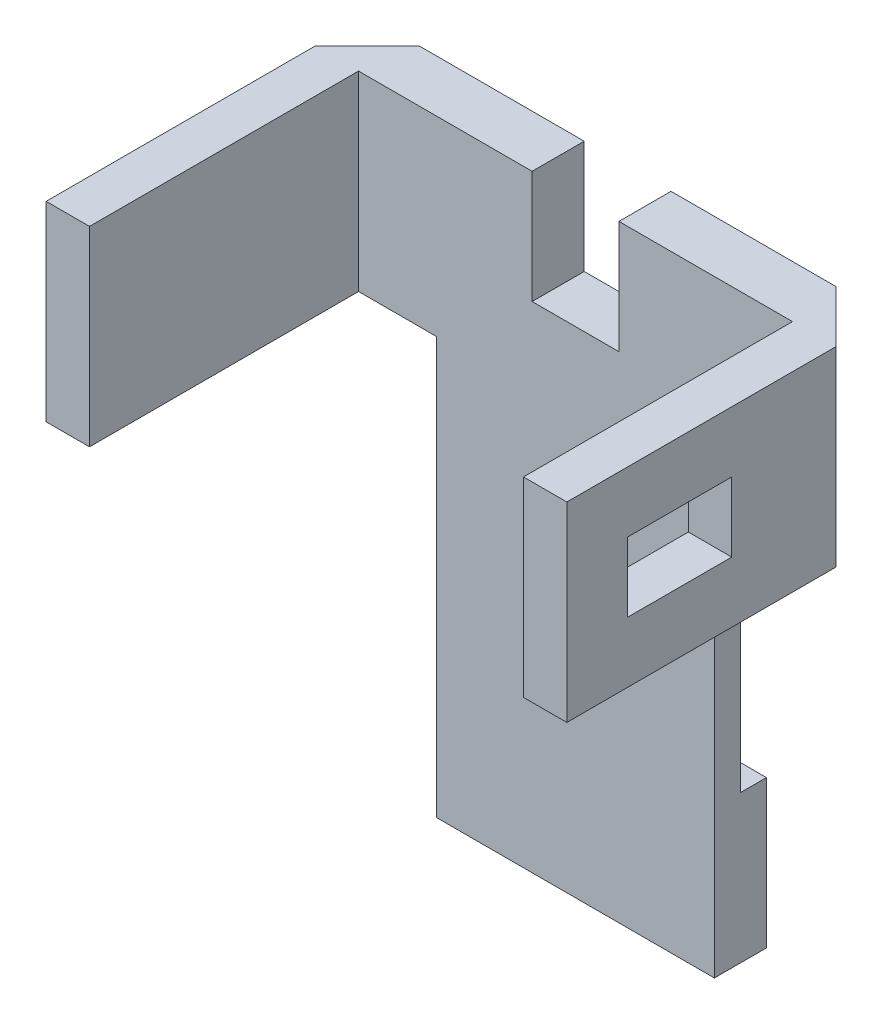
ISO-10303-21;
HEADER;
FILE_DESCRIPTION(('STEP AP214'),'2;1');
FILE_NAME('part.step','',(''),(''),'','','');
FILE_SCHEMA(('AUTOMOTIVE_DESIGN { 1 0 10303 214 1 1 1 1 }'));
ENDSEC;
DATA;
#1=APPLICATION_CONTEXT('core data for automotive mechanical design processes');
#2=APPLICATION_PROTOCOL_DEFINITION('international standard','automotive_design',2000,#1);
#3=PRODUCT_CONTEXT('',#1,'mechanical');
#4=PRODUCT('Part','Part','',(#3));
#5=PRODUCT_RELATED_PRODUCT_CATEGORY('part','',(#4));
#6=PRODUCT_DEFINITION_FORMATION('','',#4);
#7=PRODUCT_DEFINITION_CONTEXT('part definition',#1,'design');
#8=PRODUCT_DEFINITION('design','',#6,#7);
#9=PRODUCT_DEFINITION_SHAPE('','',#8);
#10=(LENGTH_UNIT() NAMED_UNIT(*) SI_UNIT(.MILLI.,.METRE.));
#11=(NAMED_UNIT(*) PLANE_ANGLE_UNIT() SI_UNIT($,.RADIAN.));
#12=(NAMED_UNIT(*) SI_UNIT($,.STERADIAN.) SOLID_ANGLE_UNIT());
#13=UNCERTAINTY_MEASURE_WITH_UNIT(LENGTH_MEASURE(1.E-05),#10,'distance_accuracy_value','');
#14=(GEOMETRIC_REPRESENTATION_CONTEXT(3) GLOBAL_UNCERTAINTY_ASSIGNED_CONTEXT((#13)) GLOBAL_UNIT_ASSIGNED_CONTEXT((#10,
#11,#12)) REPRESENTATION_CONTEXT('',''));
#15=CARTESIAN_POINT('',(0.,0.,0.));
#16=DIRECTION('',(0.,0.,1.));
#17=DIRECTION('',(1.,0.,0.));
#18=AXIS2_PLACEMENT_3D('',#15,#16,#17);
#19=CARTESIAN_POINT('',(0.,0.,0.));
#20=DIRECTION('',(0.,0.,1.));
#21=DIRECTION('',(1.,0.,0.));
#22=AXIS2_PLACEMENT_3D('',#19,#20,#21);
#23=PLANE('',#22);
#24=DIRECTION('',(0.,1.,0.));
#25=VECTOR('',#24,1.);
#26=CARTESIAN_POINT('',(-31.,0.,0.));
#27=LINE('',#26,#25);
#28=CARTESIAN_POINT('',(-31.,-35.,0.));
#29=VERTEX_POINT('',#28);
#30=CARTESIAN_POINT('',(-31.,-18.,0.));
#31=VERTEX_POINT('',#30);
#32=EDGE_CURVE('E235',#29,#31,#27,.T.);
#33=ORIENTED_EDGE('',*,*,#32,.T.);
#34=DIRECTION('',(1.,0.,0.));
#35=VECTOR('',#34,1.);
#36=CARTESIAN_POINT('',(0.,-18.,0.));
#37=LINE('',#36,#35);
#38=CARTESIAN_POINT('',(1.,-18.,0.));
#39=VERTEX_POINT('',#38);
#40=EDGE_CURVE('E218',#31,#39,#37,.T.);
#41=ORIENTED_EDGE('',*,*,#40,.T.);
#42=DIRECTION('',(0.,1.,0.));
#43=VECTOR('',#42,1.);
#44=CARTESIAN_POINT('',(1.,0.,0.));
#45=LINE('',#44,#43);
#46=CARTESIAN_POINT('',(1.,-35.,0.));
#47=VERTEX_POINT('',#46);
#48=EDGE_CURVE('E404',#47,#39,#45,.T.);
#49=ORIENTED_EDGE('',*,*,#48,.F.);
#50=DIRECTION('',(1.,0.,0.));
#51=VECTOR('',#50,1.);
#52=CARTESIAN_POINT('',(0.,-35.,0.));
#53=LINE('',#52,#51);
#54=EDGE_CURVE('E415',#29,#47,#53,.T.);
#55=ORIENTED_EDGE('',*,*,#54,.F.);
#56=EDGE_LOOP('',(#33,#41,#49,#55));
#57=FACE_BOUND('',#56,.T.);
#58=ADVANCED_FACE('F36',(#57),#23,.F.);
#59=DIRECTION('',(-1.,0.,0.));
#60=VECTOR('',#59,1.);
#61=CARTESIAN_POINT('',(0.,3.,0.));
#62=LINE('',#61,#60);
#63=CARTESIAN_POINT('',(1.,3.,0.));
#64=VERTEX_POINT('',#63);
#65=CARTESIAN_POINT('',(-31.,3.,0.));
#66=VERTEX_POINT('',#65);
#67=EDGE_CURVE('E206',#64,#66,#62,.T.);
#68=ORIENTED_EDGE('',*,*,#67,.T.);
#69=CARTESIAN_POINT('',(-31.,13.,0.));
#70=VERTEX_POINT('',#69);
#71=EDGE_CURVE('E211',#66,#70,#27,.T.);
#72=ORIENTED_EDGE('',*,*,#71,.T.);
#73=DIRECTION('',(1.,0.,0.));
#74=VECTOR('',#73,1.);
#75=CARTESIAN_POINT('',(-30.,13.,0.));
#76=LINE('',#75,#74);
#77=CARTESIAN_POINT('',(-39.,13.,0.));
#78=VERTEX_POINT('',#77);
#79=EDGE_CURVE('E236',#78,#70,#76,.T.);
#80=ORIENTED_EDGE('',*,*,#79,.F.);
#81=DIRECTION('',(0.,1.,0.));
#82=VECTOR('',#81,1.);
#83=CARTESIAN_POINT('',(-39.,35.,0.));
#84=LINE('',#83,#82);
#85=CARTESIAN_POINT('',(-39.,35.,0.));
#86=VERTEX_POINT('',#85);
#87=EDGE_CURVE('E346',#78,#86,#84,.T.);
#88=ORIENTED_EDGE('',*,*,#87,.T.);
#89=DIRECTION('',(-1.,0.,0.));
#90=VECTOR('',#89,1.);
#91=CARTESIAN_POINT('',(-30.,35.,0.));
#92=LINE('',#91,#90);
#93=CARTESIAN_POINT('',(-20.,35.,0.));
#94=VERTEX_POINT('',#93);
#95=EDGE_CURVE('E240',#94,#86,#92,.T.);
#96=ORIENTED_EDGE('',*,*,#95,.F.);
#97=DIRECTION('',(0.,-1.,0.));
#98=VECTOR('',#97,1.);
#99=CARTESIAN_POINT('',(-20.,0.,0.));
#100=LINE('',#99,#98);
#101=CARTESIAN_POINT('',(-20.,22.,0.));
#102=VERTEX_POINT('',#101);
#103=EDGE_CURVE('E239',#94,#102,#100,.T.);
#104=ORIENTED_EDGE('',*,*,#103,.T.);
#105=DIRECTION('',(1.,0.,0.));
#106=VECTOR('',#105,1.);
#107=CARTESIAN_POINT('',(0.,22.,0.));
#108=LINE('',#107,#106);
#109=CARTESIAN_POINT('',(-10.,22.,0.));
#110=VERTEX_POINT('',#109);
#111=EDGE_CURVE('E453',#102,#110,#108,.T.);
#112=ORIENTED_EDGE('',*,*,#111,.T.);
#113=DIRECTION('',(0.,-1.,0.));
#114=VECTOR('',#113,1.);
#115=CARTESIAN_POINT('',(-9.99999999999999,0.,0.));
#116=LINE('',#115,#114);
#117=CARTESIAN_POINT('',(-10.,35.,0.));
#118=VERTEX_POINT('',#117);
#119=EDGE_CURVE('E451',#118,#110,#116,.T.);
#120=ORIENTED_EDGE('',*,*,#119,.F.);
#121=DIRECTION('',(1.,0.,0.));
#122=VECTOR('',#121,1.);
#123=CARTESIAN_POINT('',(0.,35.,0.));
#124=LINE('',#123,#122);
#125=CARTESIAN_POINT('',(8.99999999999998,35.,0.));
#126=VERTEX_POINT('',#125);
#127=EDGE_CURVE('E331',#118,#126,#124,.T.);
#128=ORIENTED_EDGE('',*,*,#127,.T.);
#129=DIRECTION('',(0.,-1.,0.));
#130=VECTOR('',#129,1.);
#131=CARTESIAN_POINT('',(8.99999999999998,0.,0.));
#132=LINE('',#131,#130);
#133=CARTESIAN_POINT('',(8.99999999999998,13.,0.));
#134=VERTEX_POINT('',#133);
#135=EDGE_CURVE('E340',#126,#134,#132,.T.);
#136=ORIENTED_EDGE('',*,*,#135,.T.);
#137=DIRECTION('',(-1.,0.,0.));
#138=VECTOR('',#137,1.);
#139=CARTESIAN_POINT('',(0.,13.,0.));
#140=LINE('',#139,#138);
#141=CARTESIAN_POINT('',(1.,13.,0.));
#142=VERTEX_POINT('',#141);
#143=EDGE_CURVE('E411',#134,#142,#140,.T.);
#144=ORIENTED_EDGE('',*,*,#143,.T.);
#145=EDGE_CURVE('E214',#64,#142,#45,.T.);
#146=ORIENTED_EDGE('',*,*,#145,.F.);
#147=EDGE_LOOP('',(#68,#72,#80,#88,#96,#104,#112,#120,#128,#136,#144,#146));
#148=FACE_BOUND('',#147,.T.);
#149=ADVANCED_FACE('F208',(#148),#23,.F.);
#150=CARTESIAN_POINT('',(-31.,0.,6.));
#151=DIRECTION('',(-1.,0.,0.));
#152=DIRECTION('',(0.,-1.,0.));
#153=AXIS2_PLACEMENT_3D('',#150,#151,#152);
#154=PLANE('',#153);
#155=DIRECTION('',(0.,-1.,0.));
#156=VECTOR('',#155,1.);
#157=CARTESIAN_POINT('',(-31.,0.,3.));
#158=LINE('',#157,#156);
#159=CARTESIAN_POINT('',(-31.,3.,3.));
#160=VERTEX_POINT('',#159);
#161=CARTESIAN_POINT('',(-31.,-18.,3.));
#162=VERTEX_POINT('',#161);
#163=EDGE_CURVE('E228',#160,#162,#158,.T.);
#164=ORIENTED_EDGE('',*,*,#163,.T.);
#165=DIRECTION('',(0.,0.,-1.));
#166=VECTOR('',#165,1.);
#167=CARTESIAN_POINT('',(-31.,-18.,6.));
#168=LINE('',#167,#166);
#169=EDGE_CURVE('E381',#162,#31,#168,.T.);
#170=ORIENTED_EDGE('',*,*,#169,.T.);
#171=ORIENTED_EDGE('',*,*,#32,.F.);
#172=DIRECTION('',(0.,0.,-1.));
#173=VECTOR('',#172,1.);
#174=CARTESIAN_POINT('',(-31.,-35.,6.));
#175=LINE('',#174,#173);
#176=CARTESIAN_POINT('',(-31.,-35.,6.));
#177=VERTEX_POINT('',#176);
#178=EDGE_CURVE('E253',#177,#29,#175,.T.);
#179=ORIENTED_EDGE('',*,*,#178,.F.);
#180=DIRECTION('',(0.,1.,0.));
#181=VECTOR('',#180,1.);
#182=CARTESIAN_POINT('',(-31.,0.,6.));
#183=LINE('',#182,#181);
#184=CARTESIAN_POINT('',(-31.,13.,6.));
#185=VERTEX_POINT('',#184);
#186=EDGE_CURVE('E369',#177,#185,#183,.T.);
#187=ORIENTED_EDGE('',*,*,#186,.T.);
#188=DIRECTION('',(0.,0.,-1.));
#189=VECTOR('',#188,1.);
#190=CARTESIAN_POINT('',(-31.,13.,6.));
#191=LINE('',#190,#189);
#192=EDGE_CURVE('E234',#185,#70,#191,.T.);
#193=ORIENTED_EDGE('',*,*,#192,.T.);
#194=ORIENTED_EDGE('',*,*,#71,.F.);
#195=DIRECTION('',(0.,0.,1.));
#196=VECTOR('',#195,1.);
#197=CARTESIAN_POINT('',(-31.,3.,6.));
#198=LINE('',#197,#196);
#199=EDGE_CURVE('E221',#66,#160,#198,.T.);
#200=ORIENTED_EDGE('',*,*,#199,.T.);
#201=EDGE_LOOP('',(#164,#170,#171,#179,#187,#193,#194,#200));
#202=FACE_BOUND('',#201,.T.);
#203=ADVANCED_FACE('F231',(#202),#154,.T.);
#204=CARTESIAN_POINT('',(0.,35.,6.));
#205=DIRECTION('',(0.,1.,0.));
#206=DIRECTION('',(0.,0.,1.));
#207=AXIS2_PLACEMENT_3D('',#204,#205,#206);
#208=PLANE('',#207);
#209=DIRECTION('',(0.,0.,-1.));
#210=VECTOR('',#209,1.);
#211=CARTESIAN_POINT('',(15.,35.,6.));
#212=LINE('',#211,#210);
#213=CARTESIAN_POINT('',(15.,35.,37.));
#214=VERTEX_POINT('',#213);
#215=CARTESIAN_POINT('',(15.,35.,5.99999999999999));
#216=VERTEX_POINT('',#215);
#217=EDGE_CURVE('E419',#214,#216,#212,.T.);
#218=ORIENTED_EDGE('',*,*,#217,.T.);
#219=DIRECTION('',(0.707106781186549,0.,0.707106781186546));
#220=VECTOR('',#219,1.);
#221=CARTESIAN_POINT('',(7.49999999999997,35.,-1.5));
#222=LINE('',#221,#220);
#223=EDGE_CURVE('E337',#216,#126,#222,.F.);
#224=ORIENTED_EDGE('',*,*,#223,.T.);
#225=ORIENTED_EDGE('',*,*,#127,.F.);
#226=DIRECTION('',(0.,0.,-1.));
#227=VECTOR('',#226,1.);
#228=CARTESIAN_POINT('',(-10.,35.,6.));
#229=LINE('',#228,#227);
#230=CARTESIAN_POINT('',(-10.,35.,6.));
#231=VERTEX_POINT('',#230);
#232=EDGE_CURVE('E338',#231,#118,#229,.T.);
#233=ORIENTED_EDGE('',*,*,#232,.F.);
#234=DIRECTION('',(1.,0.,0.));
#235=VECTOR('',#234,1.);
#236=CARTESIAN_POINT('',(0.,35.,6.));
#237=LINE('',#236,#235);
#238=CARTESIAN_POINT('',(10.,35.,6.));
#239=VERTEX_POINT('',#238);
#240=EDGE_CURVE('E413',#231,#239,#237,.T.);
#241=ORIENTED_EDGE('',*,*,#240,.T.);
#242=DIRECTION('',(0.,0.,-1.));
#243=VECTOR('',#242,1.);
#244=CARTESIAN_POINT('',(10.,35.,37.));
#245=LINE('',#244,#243);
#246=CARTESIAN_POINT('',(10.,35.,37.));
#247=VERTEX_POINT('',#246);
#248=EDGE_CURVE('E326',#247,#239,#245,.T.);
#249=ORIENTED_EDGE('',*,*,#248,.F.);
#250=DIRECTION('',(-1.,0.,0.));
#251=VECTOR('',#250,1.);
#252=CARTESIAN_POINT('',(15.,35.,37.));
#253=LINE('',#252,#251);
#254=EDGE_CURVE('E305',#214,#247,#253,.T.);
#255=ORIENTED_EDGE('',*,*,#254,.F.);
#256=EDGE_LOOP('',(#218,#224,#225,#233,#241,#249,#255));
#257=FACE_BOUND('',#256,.T.);
#258=ADVANCED_FACE('F499',(#257),#208,.T.);
#259=CARTESIAN_POINT('',(-9.99999999999999,0.,6.));
#260=DIRECTION('',(1.,0.,0.));
#261=DIRECTION('',(0.,1.,0.));
#262=AXIS2_PLACEMENT_3D('',#259,#260,#261);
#263=PLANE('',#262);
#264=ORIENTED_EDGE('',*,*,#119,.T.);
#265=DIRECTION('',(0.,0.,-1.));
#266=VECTOR('',#265,1.);
#267=CARTESIAN_POINT('',(-10.,22.,6.));
#268=LINE('',#267,#266);
#269=CARTESIAN_POINT('',(-10.,22.,6.));
#270=VERTEX_POINT('',#269);
#271=EDGE_CURVE('E429',#270,#110,#268,.T.);
#272=ORIENTED_EDGE('',*,*,#271,.F.);
#273=DIRECTION('',(0.,-1.,0.));
#274=VECTOR('',#273,1.);
#275=CARTESIAN_POINT('',(-9.99999999999999,0.,6.));
#276=LINE('',#275,#274);
#277=EDGE_CURVE('E432',#231,#270,#276,.T.);
#278=ORIENTED_EDGE('',*,*,#277,.F.);
#279=ORIENTED_EDGE('',*,*,#232,.T.);
#280=EDGE_LOOP('',(#264,#272,#278,#279));
#281=FACE_BOUND('',#280,.T.);
#282=ADVANCED_FACE('F495',(#281),#263,.F.);
#283=CARTESIAN_POINT('',(0.,22.,6.));
#284=DIRECTION('',(0.,1.,0.));
#285=DIRECTION('',(0.,0.,1.));
#286=AXIS2_PLACEMENT_3D('',#283,#284,#285);
#287=PLANE('',#286);
#288=ORIENTED_EDGE('',*,*,#111,.F.);
#289=DIRECTION('',(0.,0.,-1.));
#290=VECTOR('',#289,1.);
#291=CARTESIAN_POINT('',(-20.,22.,6.));
#292=LINE('',#291,#290);
#293=CARTESIAN_POINT('',(-20.,22.,6.));
#294=VERTEX_POINT('',#293);
#295=EDGE_CURVE('E249',#294,#102,#292,.T.);
#296=ORIENTED_EDGE('',*,*,#295,.F.);
#297=DIRECTION('',(1.,0.,0.));
#298=VECTOR('',#297,1.);
#299=CARTESIAN_POINT('',(0.,22.,6.));
#300=LINE('',#299,#298);
#301=EDGE_CURVE('E436',#294,#270,#300,.T.);
#302=ORIENTED_EDGE('',*,*,#301,.T.);
#303=ORIENTED_EDGE('',*,*,#271,.T.);
#304=EDGE_LOOP('',(#288,#296,#302,#303));
#305=FACE_BOUND('',#304,.T.);
#306=ADVANCED_FACE('F492',(#305),#287,.T.);
#307=CARTESIAN_POINT('',(0.,-35.,6.));
#308=DIRECTION('',(0.,1.,0.));
#309=DIRECTION('',(0.,0.,1.));
#310=AXIS2_PLACEMENT_3D('',#307,#308,#309);
#311=PLANE('',#310);
#312=ORIENTED_EDGE('',*,*,#54,.T.);
#313=DIRECTION('',(0.,0.,-1.));
#314=VECTOR('',#313,1.);
#315=CARTESIAN_POINT('',(1.,-35.,6.));
#316=LINE('',#315,#314);
#317=CARTESIAN_POINT('',(1.,-35.,6.));
#318=VERTEX_POINT('',#317);
#319=EDGE_CURVE('E410',#318,#47,#316,.T.);
#320=ORIENTED_EDGE('',*,*,#319,.F.);
#321=DIRECTION('',(1.,0.,0.));
#322=VECTOR('',#321,1.);
#323=CARTESIAN_POINT('',(0.,-35.,6.));
#324=LINE('',#323,#322);
#325=EDGE_CURVE('E441',#177,#318,#324,.T.);
#326=ORIENTED_EDGE('',*,*,#325,.F.);
#327=ORIENTED_EDGE('',*,*,#178,.T.);
#328=EDGE_LOOP('',(#312,#320,#326,#327));
#329=FACE_BOUND('',#328,.T.);
#330=ADVANCED_FACE('F457',(#329),#311,.F.);
#331=CARTESIAN_POINT('',(1.,0.,6.));
#332=DIRECTION('',(-1.,0.,0.));
#333=DIRECTION('',(0.,0.,1.));
#334=AXIS2_PLACEMENT_3D('',#331,#332,#333);
#335=PLANE('',#334);
#336=DIRECTION('',(0.,1.,0.));
#337=VECTOR('',#336,1.);
#338=CARTESIAN_POINT('',(1.,0.,3.));
#339=LINE('',#338,#337);
#340=CARTESIAN_POINT('',(1.,-18.,3.));
#341=VERTEX_POINT('',#340);
#342=CARTESIAN_POINT('',(1.,3.,3.));
#343=VERTEX_POINT('',#342);
#344=EDGE_CURVE('E217',#341,#343,#339,.T.);
#345=ORIENTED_EDGE('',*,*,#344,.T.);
#346=DIRECTION('',(0.,0.,-1.));
#347=VECTOR('',#346,1.);
#348=CARTESIAN_POINT('',(1.,3.,6.));
#349=LINE('',#348,#347);
#350=EDGE_CURVE('E267',#343,#64,#349,.T.);
#351=ORIENTED_EDGE('',*,*,#350,.T.);
#352=ORIENTED_EDGE('',*,*,#145,.T.);
#353=DIRECTION('',(0.,0.,-1.));
#354=VECTOR('',#353,1.);
#355=CARTESIAN_POINT('',(1.,13.,6.));
#356=LINE('',#355,#354);
#357=CARTESIAN_POINT('',(1.,13.,6.));
#358=VERTEX_POINT('',#357);
#359=EDGE_CURVE('E425',#358,#142,#356,.T.);
#360=ORIENTED_EDGE('',*,*,#359,.F.);
#361=DIRECTION('',(0.,1.,0.));
#362=VECTOR('',#361,1.);
#363=CARTESIAN_POINT('',(1.,0.,6.));
#364=LINE('',#363,#362);
#365=EDGE_CURVE('E445',#318,#358,#364,.T.);
#366=ORIENTED_EDGE('',*,*,#365,.F.);
#367=ORIENTED_EDGE('',*,*,#319,.T.);
#368=ORIENTED_EDGE('',*,*,#48,.T.);
#369=DIRECTION('',(0.,0.,1.));
#370=VECTOR('',#369,1.);
#371=CARTESIAN_POINT('',(1.,-18.,6.));
#372=LINE('',#371,#370);
#373=EDGE_CURVE('E263',#39,#341,#372,.T.);
#374=ORIENTED_EDGE('',*,*,#373,.T.);
#375=EDGE_LOOP('',(#345,#351,#352,#360,#366,#367,#368,#374));
#376=FACE_BOUND('',#375,.T.);
#377=ADVANCED_FACE('F407',(#376),#335,.F.);
#378=CARTESIAN_POINT('',(0.,13.,6.));
#379=DIRECTION('',(0.,-1.,0.));
#380=DIRECTION('',(0.,0.,-1.));
#381=AXIS2_PLACEMENT_3D('',#378,#379,#380);
#382=PLANE('',#381);
#383=ORIENTED_EDGE('',*,*,#143,.F.);
#384=DIRECTION('',(-0.707106781186549,0.,-0.707106781186546));
#385=VECTOR('',#384,1.);
#386=CARTESIAN_POINT('',(7.49999999999997,13.,-1.5));
#387=LINE('',#386,#385);
#388=CARTESIAN_POINT('',(15.,13.,5.99999999999999));
#389=VERTEX_POINT('',#388);
#390=EDGE_CURVE('E342',#134,#389,#387,.F.);
#391=ORIENTED_EDGE('',*,*,#390,.T.);
#392=DIRECTION('',(0.,0.,-1.));
#393=VECTOR('',#392,1.);
#394=CARTESIAN_POINT('',(15.,13.,6.));
#395=LINE('',#394,#393);
#396=CARTESIAN_POINT('',(15.,13.,37.));
#397=VERTEX_POINT('',#396);
#398=EDGE_CURVE('E422',#397,#389,#395,.T.);
#399=ORIENTED_EDGE('',*,*,#398,.F.);
#400=DIRECTION('',(1.,0.,0.));
#401=VECTOR('',#400,1.);
#402=CARTESIAN_POINT('',(15.,13.,37.));
#403=LINE('',#402,#401);
#404=CARTESIAN_POINT('',(10.,13.,37.));
#405=VERTEX_POINT('',#404);
#406=EDGE_CURVE('E309',#405,#397,#403,.T.);
#407=ORIENTED_EDGE('',*,*,#406,.F.);
#408=DIRECTION('',(0.,0.,-1.));
#409=VECTOR('',#408,1.);
#410=CARTESIAN_POINT('',(10.,13.,37.));
#411=LINE('',#410,#409);
#412=CARTESIAN_POINT('',(10.,13.,6.));
#413=VERTEX_POINT('',#412);
#414=EDGE_CURVE('E312',#405,#413,#411,.T.);
#415=ORIENTED_EDGE('',*,*,#414,.T.);
#416=DIRECTION('',(-1.,0.,0.));
#417=VECTOR('',#416,1.);
#418=CARTESIAN_POINT('',(0.,13.,6.));
#419=LINE('',#418,#417);
#420=EDGE_CURVE('E321',#413,#358,#419,.T.);
#421=ORIENTED_EDGE('',*,*,#420,.T.);
#422=ORIENTED_EDGE('',*,*,#359,.T.);
#423=EDGE_LOOP('',(#383,#391,#399,#407,#415,#421,#422));
#424=FACE_BOUND('',#423,.T.);
#425=ADVANCED_FACE('F483',(#424),#382,.T.);
#426=CARTESIAN_POINT('',(15.,0.,6.));
#427=DIRECTION('',(-1.,0.,0.));
#428=DIRECTION('',(0.,0.,1.));
#429=AXIS2_PLACEMENT_3D('',#426,#427,#428);
#430=PLANE('',#429);
#431=DIRECTION('',(0.,0.,1.));
#432=VECTOR('',#431,1.);
#433=CARTESIAN_POINT('',(15.,20.,18.));
#434=LINE('',#433,#432);
#435=CARTESIAN_POINT('',(15.,20.,18.));
#436=VERTEX_POINT('',#435);
#437=CARTESIAN_POINT('',(15.,20.,30.));
#438=VERTEX_POINT('',#437);
#439=EDGE_CURVE('E280',#436,#438,#434,.T.);
#440=ORIENTED_EDGE('',*,*,#439,.T.);
#441=DIRECTION('',(0.,1.,0.));
#442=VECTOR('',#441,1.);
#443=CARTESIAN_POINT('',(15.,28.,30.));
#444=LINE('',#443,#442);
#445=CARTESIAN_POINT('',(15.,28.,30.));
#446=VERTEX_POINT('',#445);
#447=EDGE_CURVE('E270',#438,#446,#444,.T.);
#448=ORIENTED_EDGE('',*,*,#447,.T.);
#449=DIRECTION('',(0.,0.,-1.));
#450=VECTOR('',#449,1.);
#451=CARTESIAN_POINT('',(15.,28.,18.));
#452=LINE('',#451,#450);
#453=CARTESIAN_POINT('',(15.,28.,18.));
#454=VERTEX_POINT('',#453);
#455=EDGE_CURVE('E273',#446,#454,#452,.T.);
#456=ORIENTED_EDGE('',*,*,#455,.T.);
#457=DIRECTION('',(0.,-1.,0.));
#458=VECTOR('',#457,1.);
#459=CARTESIAN_POINT('',(15.,28.,18.));
#460=LINE('',#459,#458);
#461=EDGE_CURVE('E277',#454,#436,#460,.T.);
#462=ORIENTED_EDGE('',*,*,#461,.T.);
#463=EDGE_LOOP('',(#440,#448,#456,#462));
#464=FACE_BOUND('',#463,.T.);
#465=ORIENTED_EDGE('',*,*,#398,.T.);
#466=DIRECTION('',(0.,1.,0.));
#467=VECTOR('',#466,1.);
#468=CARTESIAN_POINT('',(15.,0.,5.99999999999999));
#469=LINE('',#468,#467);
#470=EDGE_CURVE('E334',#389,#216,#469,.T.);
#471=ORIENTED_EDGE('',*,*,#470,.T.);
#472=ORIENTED_EDGE('',*,*,#217,.F.);
#473=DIRECTION('',(0.,1.,0.));
#474=VECTOR('',#473,1.);
#475=CARTESIAN_POINT('',(15.,13.,37.));
#476=LINE('',#475,#474);
#477=EDGE_CURVE('E302',#397,#214,#476,.T.);
#478=ORIENTED_EDGE('',*,*,#477,.F.);
#479=EDGE_LOOP('',(#465,#471,#472,#478));
#480=FACE_BOUND('',#479,.T.);
#481=ADVANCED_FACE('F480',(#464,#480),#430,.F.);
#482=CARTESIAN_POINT('',(0.,0.,6.));
#483=DIRECTION('',(0.,0.,1.));
#484=DIRECTION('',(1.,0.,0.));
#485=AXIS2_PLACEMENT_3D('',#482,#483,#484);
#486=PLANE('',#485);
#487=DIRECTION('',(0.,-1.,0.));
#488=VECTOR('',#487,1.);
#489=CARTESIAN_POINT('',(-40.,13.,6.));
#490=LINE('',#489,#488);
#491=CARTESIAN_POINT('',(-40.,35.,6.));
#492=VERTEX_POINT('',#491);
#493=CARTESIAN_POINT('',(-40.,13.,6.));
#494=VERTEX_POINT('',#493);
#495=EDGE_CURVE('E377',#492,#494,#490,.T.);
#496=ORIENTED_EDGE('',*,*,#495,.T.);
#497=DIRECTION('',(1.,0.,0.));
#498=VECTOR('',#497,1.);
#499=CARTESIAN_POINT('',(-30.,13.,6.));
#500=LINE('',#499,#498);
#501=EDGE_CURVE('E371',#494,#185,#500,.T.);
#502=ORIENTED_EDGE('',*,*,#501,.T.);
#503=ORIENTED_EDGE('',*,*,#186,.F.);
#504=ORIENTED_EDGE('',*,*,#325,.T.);
#505=ORIENTED_EDGE('',*,*,#365,.T.);
#506=ORIENTED_EDGE('',*,*,#420,.F.);
#507=DIRECTION('',(0.,-1.,0.));
#508=VECTOR('',#507,1.);
#509=CARTESIAN_POINT('',(10.,13.,6.));
#510=LINE('',#509,#508);
#511=EDGE_CURVE('E295',#239,#413,#510,.T.);
#512=ORIENTED_EDGE('',*,*,#511,.F.);
#513=ORIENTED_EDGE('',*,*,#240,.F.);
#514=ORIENTED_EDGE('',*,*,#277,.T.);
#515=ORIENTED_EDGE('',*,*,#301,.F.);
#516=DIRECTION('',(0.,-1.,0.));
#517=VECTOR('',#516,1.);
#518=CARTESIAN_POINT('',(-20.,0.,6.));
#519=LINE('',#518,#517);
#520=CARTESIAN_POINT('',(-20.,35.,6.));
#521=VERTEX_POINT('',#520);
#522=EDGE_CURVE('E250',#521,#294,#519,.T.);
#523=ORIENTED_EDGE('',*,*,#522,.F.);
#524=DIRECTION('',(-1.,0.,0.));
#525=VECTOR('',#524,1.);
#526=CARTESIAN_POINT('',(-30.,35.,6.));
#527=LINE('',#526,#525);
#528=EDGE_CURVE('E246',#521,#492,#527,.T.);
#529=ORIENTED_EDGE('',*,*,#528,.T.);
#530=EDGE_LOOP('',(#496,#502,#503,#504,#505,#506,#512,#513,#514,#515,#523,#529));
#531=FACE_BOUND('',#530,.T.);
#532=ADVANCED_FACE('F460',(#531),#486,.T.);
#533=CARTESIAN_POINT('',(10.,13.,37.));
#534=DIRECTION('',(1.,0.,0.));
#535=DIRECTION('',(0.,0.,-1.));
#536=AXIS2_PLACEMENT_3D('',#533,#534,#535);
#537=PLANE('',#536);
#538=DIRECTION('',(0.,0.,-1.));
#539=VECTOR('',#538,1.);
#540=CARTESIAN_POINT('',(10.,28.,18.));
#541=LINE('',#540,#539);
#542=CARTESIAN_POINT('',(10.,28.,30.));
#543=VERTEX_POINT('',#542);
#544=CARTESIAN_POINT('',(10.,28.,18.));
#545=VERTEX_POINT('',#544);
#546=EDGE_CURVE('E285',#543,#545,#541,.T.);
#547=ORIENTED_EDGE('',*,*,#546,.F.);
#548=DIRECTION('',(0.,1.,0.));
#549=VECTOR('',#548,1.);
#550=CARTESIAN_POINT('',(10.,28.,30.));
#551=LINE('',#550,#549);
#552=CARTESIAN_POINT('',(10.,20.,30.));
#553=VERTEX_POINT('',#552);
#554=EDGE_CURVE('E269',#553,#543,#551,.T.);
#555=ORIENTED_EDGE('',*,*,#554,.F.);
#556=DIRECTION('',(0.,0.,1.));
#557=VECTOR('',#556,1.);
#558=CARTESIAN_POINT('',(10.,20.,18.));
#559=LINE('',#558,#557);
#560=CARTESIAN_POINT('',(10.,20.,18.));
#561=VERTEX_POINT('',#560);
#562=EDGE_CURVE('E274',#561,#553,#559,.T.);
#563=ORIENTED_EDGE('',*,*,#562,.F.);
#564=DIRECTION('',(0.,-1.,0.));
#565=VECTOR('',#564,1.);
#566=CARTESIAN_POINT('',(10.,28.,18.));
#567=LINE('',#566,#565);
#568=EDGE_CURVE('E288',#545,#561,#567,.T.);
#569=ORIENTED_EDGE('',*,*,#568,.F.);
#570=EDGE_LOOP('',(#547,#555,#563,#569));
#571=FACE_BOUND('',#570,.T.);
#572=ORIENTED_EDGE('',*,*,#511,.T.);
#573=ORIENTED_EDGE('',*,*,#414,.F.);
#574=DIRECTION('',(0.,-1.,0.));
#575=VECTOR('',#574,1.);
#576=CARTESIAN_POINT('',(10.,13.,37.));
#577=LINE('',#576,#575);
#578=EDGE_CURVE('E307',#247,#405,#577,.T.);
#579=ORIENTED_EDGE('',*,*,#578,.F.);
#580=ORIENTED_EDGE('',*,*,#248,.T.);
#581=EDGE_LOOP('',(#572,#573,#579,#580));
#582=FACE_BOUND('',#581,.T.);
#583=ADVANCED_FACE('F514',(#571,#582),#537,.F.);
#584=CARTESIAN_POINT('',(0.,0.,37.));
#585=DIRECTION('',(0.,0.,1.));
#586=DIRECTION('',(1.,0.,0.));
#587=AXIS2_PLACEMENT_3D('',#584,#585,#586);
#588=PLANE('',#587);
#589=ORIENTED_EDGE('',*,*,#477,.T.);
#590=ORIENTED_EDGE('',*,*,#254,.T.);
#591=ORIENTED_EDGE('',*,*,#578,.T.);
#592=ORIENTED_EDGE('',*,*,#406,.T.);
#593=EDGE_LOOP('',(#589,#590,#591,#592));
#594=FACE_BOUND('',#593,.T.);
#595=ADVANCED_FACE('F505',(#594),#588,.T.);
#596=CARTESIAN_POINT('',(15.,0.,5.99999999999999));
#597=DIRECTION('',(-0.707106781186546,0.,0.707106781186549));
#598=DIRECTION('',(0.,1.,0.));
#599=AXIS2_PLACEMENT_3D('',#596,#597,#598);
#600=PLANE('',#599);
#601=ORIENTED_EDGE('',*,*,#390,.F.);
#602=ORIENTED_EDGE('',*,*,#135,.F.);
#603=ORIENTED_EDGE('',*,*,#223,.F.);
#604=ORIENTED_EDGE('',*,*,#470,.F.);
#605=EDGE_LOOP('',(#601,#602,#603,#604));
#606=FACE_BOUND('',#605,.T.);
#607=ADVANCED_FACE('F502',(#606),#600,.F.);
#608=CARTESIAN_POINT('',(15.,28.,30.));
#609=DIRECTION('',(0.,0.,1.));
#610=DIRECTION('',(1.,0.,0.));
#611=AXIS2_PLACEMENT_3D('',#608,#609,#610);
#612=PLANE('',#611);
#613=ORIENTED_EDGE('',*,*,#554,.T.);
#614=DIRECTION('',(-1.,0.,0.));
#615=VECTOR('',#614,1.);
#616=CARTESIAN_POINT('',(15.,28.,30.));
#617=LINE('',#616,#615);
#618=EDGE_CURVE('E283',#446,#543,#617,.T.);
#619=ORIENTED_EDGE('',*,*,#618,.F.);
#620=ORIENTED_EDGE('',*,*,#447,.F.);
#621=DIRECTION('',(-1.,0.,0.));
#622=VECTOR('',#621,1.);
#623=CARTESIAN_POINT('',(15.,20.,30.));
#624=LINE('',#623,#622);
#625=EDGE_CURVE('E293',#438,#553,#624,.T.);
#626=ORIENTED_EDGE('',*,*,#625,.T.);
#627=EDGE_LOOP('',(#613,#619,#620,#626));
#628=FACE_BOUND('',#627,.T.);
#629=ADVANCED_FACE('F504',(#628),#612,.F.);
#630=CARTESIAN_POINT('',(15.,20.,18.));
#631=DIRECTION('',(0.,-1.,0.));
#632=DIRECTION('',(0.,0.,-1.));
#633=AXIS2_PLACEMENT_3D('',#630,#631,#632);
#634=PLANE('',#633);
#635=ORIENTED_EDGE('',*,*,#562,.T.);
#636=ORIENTED_EDGE('',*,*,#625,.F.);
#637=ORIENTED_EDGE('',*,*,#439,.F.);
#638=DIRECTION('',(-1.,0.,0.));
#639=VECTOR('',#638,1.);
#640=CARTESIAN_POINT('',(15.,20.,18.));
#641=LINE('',#640,#639);
#642=EDGE_CURVE('E296',#436,#561,#641,.T.);
#643=ORIENTED_EDGE('',*,*,#642,.T.);
#644=EDGE_LOOP('',(#635,#636,#637,#643));
#645=FACE_BOUND('',#644,.T.);
#646=ADVANCED_FACE('F511',(#645),#634,.F.);
#647=CARTESIAN_POINT('',(15.,28.,18.));
#648=DIRECTION('',(0.,0.,-1.));
#649=DIRECTION('',(-1.,0.,0.));
#650=AXIS2_PLACEMENT_3D('',#647,#648,#649);
#651=PLANE('',#650);
#652=ORIENTED_EDGE('',*,*,#568,.T.);
#653=ORIENTED_EDGE('',*,*,#642,.F.);
#654=ORIENTED_EDGE('',*,*,#461,.F.);
#655=DIRECTION('',(-1.,0.,0.));
#656=VECTOR('',#655,1.);
#657=CARTESIAN_POINT('',(15.,28.,18.));
#658=LINE('',#657,#656);
#659=EDGE_CURVE('E298',#454,#545,#658,.T.);
#660=ORIENTED_EDGE('',*,*,#659,.T.);
#661=EDGE_LOOP('',(#652,#653,#654,#660));
#662=FACE_BOUND('',#661,.T.);
#663=ADVANCED_FACE('F559',(#662),#651,.F.);
#664=CARTESIAN_POINT('',(15.,28.,18.));
#665=DIRECTION('',(0.,1.,0.));
#666=DIRECTION('',(0.,0.,1.));
#667=AXIS2_PLACEMENT_3D('',#664,#665,#666);
#668=PLANE('',#667);
#669=ORIENTED_EDGE('',*,*,#546,.T.);
#670=ORIENTED_EDGE('',*,*,#659,.F.);
#671=ORIENTED_EDGE('',*,*,#455,.F.);
#672=ORIENTED_EDGE('',*,*,#618,.T.);
#673=EDGE_LOOP('',(#669,#670,#671,#672));
#674=FACE_BOUND('',#673,.T.);
#675=ADVANCED_FACE('F554',(#674),#668,.F.);
#676=CARTESIAN_POINT('',(15.,-18.,3.));
#677=DIRECTION('',(0.,0.,1.));
#678=DIRECTION('',(1.,0.,0.));
#679=AXIS2_PLACEMENT_3D('',#676,#677,#678);
#680=PLANE('',#679);
#681=DIRECTION('',(-1.,0.,0.));
#682=VECTOR('',#681,1.);
#683=CARTESIAN_POINT('',(15.,-18.,3.));
#684=LINE('',#683,#682);
#685=EDGE_CURVE('E261',#341,#162,#684,.T.);
#686=ORIENTED_EDGE('',*,*,#685,.T.);
#687=ORIENTED_EDGE('',*,*,#163,.F.);
#688=DIRECTION('',(-1.,0.,0.));
#689=VECTOR('',#688,1.);
#690=CARTESIAN_POINT('',(15.,3.,3.));
#691=LINE('',#690,#689);
#692=EDGE_CURVE('E224',#343,#160,#691,.T.);
#693=ORIENTED_EDGE('',*,*,#692,.F.);
#694=ORIENTED_EDGE('',*,*,#344,.F.);
#695=EDGE_LOOP('',(#686,#687,#693,#694));
#696=FACE_BOUND('',#695,.T.);
#697=ADVANCED_FACE('F397',(#696),#680,.F.);
#698=CARTESIAN_POINT('',(15.,3.,3.));
#699=DIRECTION('',(0.,1.,0.));
#700=DIRECTION('',(-1.,0.,0.));
#701=AXIS2_PLACEMENT_3D('',#698,#699,#700);
#702=PLANE('',#701);
#703=ORIENTED_EDGE('',*,*,#692,.T.);
#704=ORIENTED_EDGE('',*,*,#199,.F.);
#705=ORIENTED_EDGE('',*,*,#67,.F.);
#706=ORIENTED_EDGE('',*,*,#350,.F.);
#707=EDGE_LOOP('',(#703,#704,#705,#706));
#708=FACE_BOUND('',#707,.T.);
#709=ADVANCED_FACE('F222',(#708),#702,.F.);
#710=CARTESIAN_POINT('',(15.,-18.,3.));
#711=DIRECTION('',(0.,-1.,0.));
#712=DIRECTION('',(1.,0.,0.));
#713=AXIS2_PLACEMENT_3D('',#710,#711,#712);
#714=PLANE('',#713);
#715=ORIENTED_EDGE('',*,*,#40,.F.);
#716=ORIENTED_EDGE('',*,*,#169,.F.);
#717=ORIENTED_EDGE('',*,*,#685,.F.);
#718=ORIENTED_EDGE('',*,*,#373,.F.);
#719=EDGE_LOOP('',(#715,#716,#717,#718));
#720=FACE_BOUND('',#719,.T.);
#721=ADVANCED_FACE('F400',(#720),#714,.F.);
#722=CARTESIAN_POINT('',(-30.,35.,6.));
#723=DIRECTION('',(0.,-1.,0.));
#724=DIRECTION('',(1.,0.,0.));
#725=AXIS2_PLACEMENT_3D('',#722,#723,#724);
#726=PLANE('',#725);
#727=ORIENTED_EDGE('',*,*,#95,.T.);
#728=DIRECTION('',(-0.707106781186548,0.,0.707106781186547));
#729=VECTOR('',#728,1.);
#730=CARTESIAN_POINT('',(-39.,35.,0.));
#731=LINE('',#730,#729);
#732=CARTESIAN_POINT('',(-45.,35.,6.00000000000001));
#733=VERTEX_POINT('',#732);
#734=EDGE_CURVE('E58',#86,#733,#731,.T.);
#735=ORIENTED_EDGE('',*,*,#734,.T.);
#736=DIRECTION('',(0.,0.,-1.));
#737=VECTOR('',#736,1.);
#738=CARTESIAN_POINT('',(-45.,35.,6.));
#739=LINE('',#738,#737);
#740=CARTESIAN_POINT('',(-45.,35.,37.));
#741=VERTEX_POINT('',#740);
#742=EDGE_CURVE('E259',#741,#733,#739,.T.);
#743=ORIENTED_EDGE('',*,*,#742,.F.);
#744=DIRECTION('',(1.,0.,0.));
#745=VECTOR('',#744,1.);
#746=CARTESIAN_POINT('',(-45.,35.,37.));
#747=LINE('',#746,#745);
#748=CARTESIAN_POINT('',(-40.,35.,37.));
#749=VERTEX_POINT('',#748);
#750=EDGE_CURVE('E376',#741,#749,#747,.T.);
#751=ORIENTED_EDGE('',*,*,#750,.T.);
#752=DIRECTION('',(0.,0.,-1.));
#753=VECTOR('',#752,1.);
#754=CARTESIAN_POINT('',(-40.,35.,37.));
#755=LINE('',#754,#753);
#756=EDGE_CURVE('E364',#749,#492,#755,.T.);
#757=ORIENTED_EDGE('',*,*,#756,.T.);
#758=ORIENTED_EDGE('',*,*,#528,.F.);
#759=DIRECTION('',(0.,0.,-1.));
#760=VECTOR('',#759,1.);
#761=CARTESIAN_POINT('',(-20.,35.,6.));
#762=LINE('',#761,#760);
#763=EDGE_CURVE('E247',#521,#94,#762,.T.);
#764=ORIENTED_EDGE('',*,*,#763,.T.);
#765=EDGE_LOOP('',(#727,#735,#743,#751,#757,#758,#764));
#766=FACE_BOUND('',#765,.T.);
#767=ADVANCED_FACE('F360',(#766),#726,.F.);
#768=CARTESIAN_POINT('',(-45.,0.,6.));
#769=DIRECTION('',(-1.,0.,0.));
#770=DIRECTION('',(0.,-1.,0.));
#771=AXIS2_PLACEMENT_3D('',#768,#769,#770);
#772=PLANE('',#771);
#773=ORIENTED_EDGE('',*,*,#742,.T.);
#774=DIRECTION('',(0.,-1.,0.));
#775=VECTOR('',#774,1.);
#776=CARTESIAN_POINT('',(-45.,13.,6.00000000000001));
#777=LINE('',#776,#775);
#778=CARTESIAN_POINT('',(-45.,13.,6.00000000000001));
#779=VERTEX_POINT('',#778);
#780=EDGE_CURVE('E44',#733,#779,#777,.T.);
#781=ORIENTED_EDGE('',*,*,#780,.T.);
#782=DIRECTION('',(0.,0.,-1.));
#783=VECTOR('',#782,1.);
#784=CARTESIAN_POINT('',(-45.,13.,6.));
#785=LINE('',#784,#783);
#786=CARTESIAN_POINT('',(-45.,13.,37.));
#787=VERTEX_POINT('',#786);
#788=EDGE_CURVE('E257',#787,#779,#785,.T.);
#789=ORIENTED_EDGE('',*,*,#788,.F.);
#790=DIRECTION('',(0.,1.,0.));
#791=VECTOR('',#790,1.);
#792=CARTESIAN_POINT('',(-45.,13.,37.));
#793=LINE('',#792,#791);
#794=EDGE_CURVE('E380',#787,#741,#793,.T.);
#795=ORIENTED_EDGE('',*,*,#794,.T.);
#796=EDGE_LOOP('',(#773,#781,#789,#795));
#797=FACE_BOUND('',#796,.T.);
#798=ADVANCED_FACE('F539',(#797),#772,.T.);
#799=CARTESIAN_POINT('',(-30.,13.,6.));
#800=DIRECTION('',(0.,1.,0.));
#801=DIRECTION('',(-1.,0.,0.));
#802=AXIS2_PLACEMENT_3D('',#799,#800,#801);
#803=PLANE('',#802);
#804=ORIENTED_EDGE('',*,*,#788,.T.);
#805=DIRECTION('',(0.707106781186548,0.,-0.707106781186547));
#806=VECTOR('',#805,1.);
#807=CARTESIAN_POINT('',(-39.,13.,0.));
#808=LINE('',#807,#806);
#809=EDGE_CURVE('E11',#779,#78,#808,.T.);
#810=ORIENTED_EDGE('',*,*,#809,.T.);
#811=ORIENTED_EDGE('',*,*,#79,.T.);
#812=ORIENTED_EDGE('',*,*,#192,.F.);
#813=ORIENTED_EDGE('',*,*,#501,.F.);
#814=DIRECTION('',(0.,0.,-1.));
#815=VECTOR('',#814,1.);
#816=CARTESIAN_POINT('',(-40.,13.,37.));
#817=LINE('',#816,#815);
#818=CARTESIAN_POINT('',(-40.,13.,37.));
#819=VERTEX_POINT('',#818);
#820=EDGE_CURVE('E362',#819,#494,#817,.T.);
#821=ORIENTED_EDGE('',*,*,#820,.F.);
#822=DIRECTION('',(-1.,0.,0.));
#823=VECTOR('',#822,1.);
#824=CARTESIAN_POINT('',(-45.,13.,37.));
#825=LINE('',#824,#823);
#826=EDGE_CURVE('E387',#819,#787,#825,.T.);
#827=ORIENTED_EDGE('',*,*,#826,.T.);
#828=EDGE_LOOP('',(#804,#810,#811,#812,#813,#821,#827));
#829=FACE_BOUND('',#828,.T.);
#830=ADVANCED_FACE('F463',(#829),#803,.F.);
#831=CARTESIAN_POINT('',(-20.,0.,6.));
#832=DIRECTION('',(1.,0.,0.));
#833=DIRECTION('',(0.,1.,0.));
#834=AXIS2_PLACEMENT_3D('',#831,#832,#833);
#835=PLANE('',#834);
#836=ORIENTED_EDGE('',*,*,#103,.F.);
#837=ORIENTED_EDGE('',*,*,#763,.F.);
#838=ORIENTED_EDGE('',*,*,#522,.T.);
#839=ORIENTED_EDGE('',*,*,#295,.T.);
#840=EDGE_LOOP('',(#836,#837,#838,#839));
#841=FACE_BOUND('',#840,.T.);
#842=ADVANCED_FACE('F533',(#841),#835,.T.);
#843=CARTESIAN_POINT('',(-40.,13.,37.));
#844=DIRECTION('',(1.,0.,0.));
#845=DIRECTION('',(0.,1.,0.));
#846=AXIS2_PLACEMENT_3D('',#843,#844,#845);
#847=PLANE('',#846);
#848=ORIENTED_EDGE('',*,*,#495,.F.);
#849=ORIENTED_EDGE('',*,*,#756,.F.);
#850=DIRECTION('',(0.,-1.,0.));
#851=VECTOR('',#850,1.);
#852=CARTESIAN_POINT('',(-40.,13.,37.));
#853=LINE('',#852,#851);
#854=EDGE_CURVE('E384',#749,#819,#853,.T.);
#855=ORIENTED_EDGE('',*,*,#854,.T.);
#856=ORIENTED_EDGE('',*,*,#820,.T.);
#857=EDGE_LOOP('',(#848,#849,#855,#856));
#858=FACE_BOUND('',#857,.T.);
#859=ADVANCED_FACE('F469',(#858),#847,.T.);
#860=CARTESIAN_POINT('',(-30.,0.,37.));
#861=DIRECTION('',(0.,0.,1.));
#862=DIRECTION('',(-1.,0.,0.));
#863=AXIS2_PLACEMENT_3D('',#860,#861,#862);
#864=PLANE('',#863);
#865=ORIENTED_EDGE('',*,*,#794,.F.);
#866=ORIENTED_EDGE('',*,*,#826,.F.);
#867=ORIENTED_EDGE('',*,*,#854,.F.);
#868=ORIENTED_EDGE('',*,*,#750,.F.);
#869=EDGE_LOOP('',(#865,#866,#867,#868));
#870=FACE_BOUND('',#869,.T.);
#871=ADVANCED_FACE('F465',(#870),#864,.T.);
#872=CARTESIAN_POINT('',(-39.,0.,0.));
#873=DIRECTION('',(-0.707106781186547,0.,-0.707106781186548));
#874=DIRECTION('',(0.,-1.,0.));
#875=AXIS2_PLACEMENT_3D('',#872,#873,#874);
#876=PLANE('',#875);
#877=ORIENTED_EDGE('',*,*,#809,.F.);
#878=ORIENTED_EDGE('',*,*,#780,.F.);
#879=ORIENTED_EDGE('',*,*,#734,.F.);
#880=ORIENTED_EDGE('',*,*,#87,.F.);
#881=EDGE_LOOP('',(#877,#878,#879,#880));
#882=FACE_BOUND('',#881,.T.);
#883=ADVANCED_FACE('F38',(#882),#876,.T.);
#884=CLOSED_SHELL('',(#58,#149,#203,#258,#282,#306,#330,#377,#425,#481,#532,#583,#595,#607,#629,
#646,#663,#675,#697,#709,#721,#767,#798,#830,#842,#859,#871,#883));
#885=MANIFOLD_SOLID_BREP('B2',#884);
#886=ADVANCED_BREP_SHAPE_REPRESENTATION('',(#18,#885),#14);
#887=SHAPE_DEFINITION_REPRESENTATION(#9,#886);
ENDSEC;
END-ISO-10303-21;
